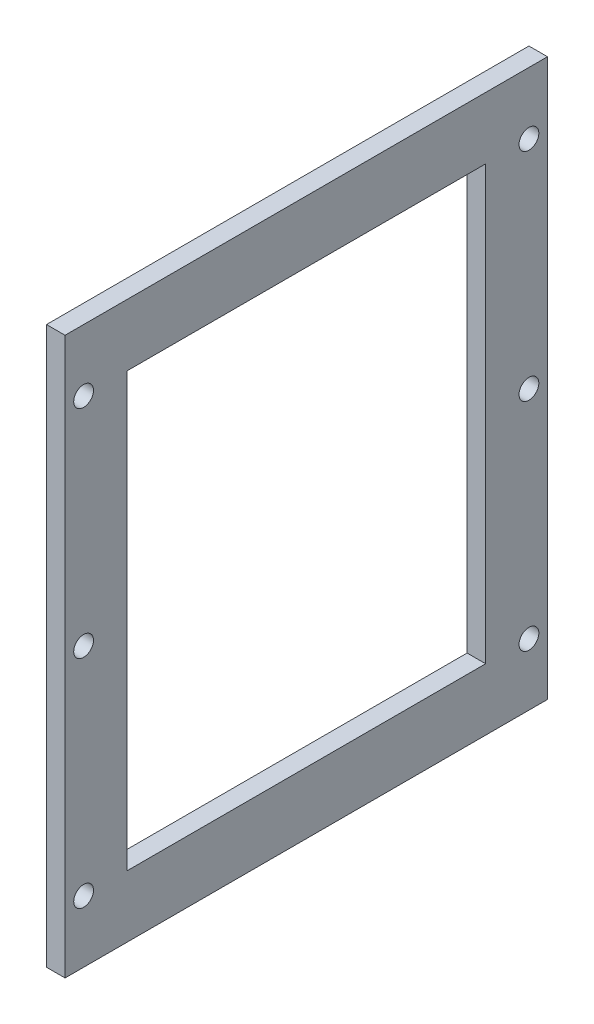
ISO-10303-21;
HEADER;
FILE_DESCRIPTION(('STEP AP214'),'2;1');
FILE_NAME('part.step','',(''),(''),'','','');
FILE_SCHEMA(('AUTOMOTIVE_DESIGN { 1 0 10303 214 1 1 1 1 }'));
ENDSEC;
DATA;
#1=APPLICATION_CONTEXT('core data for automotive mechanical design processes');
#2=APPLICATION_PROTOCOL_DEFINITION('international standard','automotive_design',2000,#1);
#3=PRODUCT_CONTEXT('',#1,'mechanical');
#4=PRODUCT('Part','Part','',(#3));
#5=PRODUCT_RELATED_PRODUCT_CATEGORY('part','',(#4));
#6=PRODUCT_DEFINITION_FORMATION('','',#4);
#7=PRODUCT_DEFINITION_CONTEXT('part definition',#1,'design');
#8=PRODUCT_DEFINITION('design','',#6,#7);
#9=PRODUCT_DEFINITION_SHAPE('','',#8);
#10=(LENGTH_UNIT() NAMED_UNIT(*) SI_UNIT(.MILLI.,.METRE.));
#11=(NAMED_UNIT(*) PLANE_ANGLE_UNIT() SI_UNIT($,.RADIAN.));
#12=(NAMED_UNIT(*) SI_UNIT($,.STERADIAN.) SOLID_ANGLE_UNIT());
#13=UNCERTAINTY_MEASURE_WITH_UNIT(LENGTH_MEASURE(1.E-05),#10,'distance_accuracy_value','');
#14=(GEOMETRIC_REPRESENTATION_CONTEXT(3) GLOBAL_UNCERTAINTY_ASSIGNED_CONTEXT((#13)) GLOBAL_UNIT_ASSIGNED_CONTEXT((#10,
#11,#12)) REPRESENTATION_CONTEXT('',''));
#15=CARTESIAN_POINT('',(0.,0.,0.));
#16=DIRECTION('',(0.,0.,1.));
#17=DIRECTION('',(1.,0.,0.));
#18=AXIS2_PLACEMENT_3D('',#15,#16,#17);
#19=CARTESIAN_POINT('',(15.,0.,0.));
#20=DIRECTION('',(1.,0.,0.));
#21=DIRECTION('',(0.,0.,-1.));
#22=AXIS2_PLACEMENT_3D('',#19,#20,#21);
#23=PLANE('',#22);
#24=CARTESIAN_POINT('',(15.,0.,-180.));
#25=DIRECTION('',(1.,0.,0.));
#26=DIRECTION('',(0.,0.,1.));
#27=AXIS2_PLACEMENT_3D('',#24,#25,#26);
#28=CIRCLE('',#27,8.00000000000001);
#29=CARTESIAN_POINT('',(15.,0.,-172.));
#30=VERTEX_POINT('',#29);
#31=EDGE_CURVE('E255',#30,#30,#28,.T.);
#32=ORIENTED_EDGE('',*,*,#31,.F.);
#33=EDGE_LOOP('',(#32));
#34=FACE_BOUND('',#33,.T.);
#35=CARTESIAN_POINT('',(15.,0.,180.));
#36=DIRECTION('',(1.,0.,0.));
#37=DIRECTION('',(0.,0.,-1.));
#38=AXIS2_PLACEMENT_3D('',#35,#36,#37);
#39=CIRCLE('',#38,8.00000000000001);
#40=CARTESIAN_POINT('',(15.,0.,172.));
#41=VERTEX_POINT('',#40);
#42=EDGE_CURVE('E267',#41,#41,#39,.T.);
#43=ORIENTED_EDGE('',*,*,#42,.F.);
#44=EDGE_LOOP('',(#43));
#45=FACE_BOUND('',#44,.T.);
#46=CARTESIAN_POINT('',(15.,175.,180.));
#47=DIRECTION('',(1.,0.,0.));
#48=DIRECTION('',(0.,0.,-1.));
#49=AXIS2_PLACEMENT_3D('',#46,#47,#48);
#50=CIRCLE('',#49,8.00000000000001);
#51=CARTESIAN_POINT('',(15.,175.,172.));
#52=VERTEX_POINT('',#51);
#53=EDGE_CURVE('E129',#52,#52,#50,.T.);
#54=ORIENTED_EDGE('',*,*,#53,.F.);
#55=EDGE_LOOP('',(#54));
#56=FACE_BOUND('',#55,.T.);
#57=DIRECTION('',(0.,1.,0.));
#58=VECTOR('',#57,1.);
#59=CARTESIAN_POINT('',(15.,225.,-195.));
#60=LINE('',#59,#58);
#61=CARTESIAN_POINT('',(15.,-225.,-195.));
#62=VERTEX_POINT('',#61);
#63=CARTESIAN_POINT('',(15.,225.,-195.));
#64=VERTEX_POINT('',#63);
#65=EDGE_CURVE('E139',#62,#64,#60,.T.);
#66=ORIENTED_EDGE('',*,*,#65,.T.);
#67=DIRECTION('',(0.,0.,1.));
#68=VECTOR('',#67,1.);
#69=CARTESIAN_POINT('',(15.,225.,195.));
#70=LINE('',#69,#68);
#71=CARTESIAN_POINT('',(15.,225.,195.));
#72=VERTEX_POINT('',#71);
#73=EDGE_CURVE('E142',#64,#72,#70,.T.);
#74=ORIENTED_EDGE('',*,*,#73,.T.);
#75=DIRECTION('',(0.,-1.,0.));
#76=VECTOR('',#75,1.);
#77=CARTESIAN_POINT('',(15.,225.,195.));
#78=LINE('',#77,#76);
#79=CARTESIAN_POINT('',(15.,-225.,195.));
#80=VERTEX_POINT('',#79);
#81=EDGE_CURVE('E145',#72,#80,#78,.T.);
#82=ORIENTED_EDGE('',*,*,#81,.T.);
#83=DIRECTION('',(0.,0.,-1.));
#84=VECTOR('',#83,1.);
#85=CARTESIAN_POINT('',(15.,-225.,195.));
#86=LINE('',#85,#84);
#87=EDGE_CURVE('E147',#80,#62,#86,.T.);
#88=ORIENTED_EDGE('',*,*,#87,.T.);
#89=EDGE_LOOP('',(#66,#74,#82,#88));
#90=FACE_BOUND('',#89,.T.);
#91=DIRECTION('',(0.,0.,1.));
#92=VECTOR('',#91,1.);
#93=CARTESIAN_POINT('',(15.,175.,145.));
#94=LINE('',#93,#92);
#95=CARTESIAN_POINT('',(15.,175.,-145.));
#96=VERTEX_POINT('',#95);
#97=CARTESIAN_POINT('',(15.,175.,145.));
#98=VERTEX_POINT('',#97);
#99=EDGE_CURVE('E108',#96,#98,#94,.T.);
#100=ORIENTED_EDGE('',*,*,#99,.F.);
#101=DIRECTION('',(0.,1.,0.));
#102=VECTOR('',#101,1.);
#103=CARTESIAN_POINT('',(15.,175.,-145.));
#104=LINE('',#103,#102);
#105=CARTESIAN_POINT('',(15.,-175.,-145.));
#106=VERTEX_POINT('',#105);
#107=EDGE_CURVE('E100',#106,#96,#104,.T.);
#108=ORIENTED_EDGE('',*,*,#107,.F.);
#109=DIRECTION('',(0.,0.,-1.));
#110=VECTOR('',#109,1.);
#111=CARTESIAN_POINT('',(15.,-175.,145.));
#112=LINE('',#111,#110);
#113=CARTESIAN_POINT('',(15.,-175.,145.));
#114=VERTEX_POINT('',#113);
#115=EDGE_CURVE('E123',#114,#106,#112,.T.);
#116=ORIENTED_EDGE('',*,*,#115,.F.);
#117=DIRECTION('',(0.,-1.,0.));
#118=VECTOR('',#117,1.);
#119=CARTESIAN_POINT('',(15.,175.,145.));
#120=LINE('',#119,#118);
#121=EDGE_CURVE('E121',#98,#114,#120,.T.);
#122=ORIENTED_EDGE('',*,*,#121,.F.);
#123=EDGE_LOOP('',(#100,#108,#116,#122));
#124=FACE_BOUND('',#123,.T.);
#125=CARTESIAN_POINT('',(15.,-175.,180.));
#126=DIRECTION('',(1.,0.,0.));
#127=DIRECTION('',(0.,0.,1.));
#128=AXIS2_PLACEMENT_3D('',#125,#126,#127);
#129=CIRCLE('',#128,8.00000000000001);
#130=CARTESIAN_POINT('',(15.,-175.,188.));
#131=VERTEX_POINT('',#130);
#132=EDGE_CURVE('E273',#131,#131,#129,.T.);
#133=ORIENTED_EDGE('',*,*,#132,.F.);
#134=EDGE_LOOP('',(#133));
#135=FACE_BOUND('',#134,.T.);
#136=CARTESIAN_POINT('',(15.,175.,-180.));
#137=DIRECTION('',(1.,0.,0.));
#138=DIRECTION('',(0.,0.,1.));
#139=AXIS2_PLACEMENT_3D('',#136,#137,#138);
#140=CIRCLE('',#139,8.00000000000001);
#141=CARTESIAN_POINT('',(15.,175.,-172.));
#142=VERTEX_POINT('',#141);
#143=EDGE_CURVE('E261',#142,#142,#140,.T.);
#144=ORIENTED_EDGE('',*,*,#143,.F.);
#145=EDGE_LOOP('',(#144));
#146=FACE_BOUND('',#145,.T.);
#147=CARTESIAN_POINT('',(15.,-175.,-180.));
#148=DIRECTION('',(1.,0.,0.));
#149=DIRECTION('',(0.,0.,-1.));
#150=AXIS2_PLACEMENT_3D('',#147,#148,#149);
#151=CIRCLE('',#150,8.00000000000001);
#152=CARTESIAN_POINT('',(15.,-175.,-188.));
#153=VERTEX_POINT('',#152);
#154=EDGE_CURVE('E246',#153,#153,#151,.T.);
#155=ORIENTED_EDGE('',*,*,#154,.F.);
#156=EDGE_LOOP('',(#155));
#157=FACE_BOUND('',#156,.T.);
#158=ADVANCED_FACE('F35',(#34,#45,#56,#90,#124,#135,#146,#157),#23,.T.);
#159=CARTESIAN_POINT('',(0.,0.,0.));
#160=DIRECTION('',(1.,0.,0.));
#161=DIRECTION('',(0.,0.,-1.));
#162=AXIS2_PLACEMENT_3D('',#159,#160,#161);
#163=PLANE('',#162);
#164=DIRECTION('',(0.,1.,0.));
#165=VECTOR('',#164,1.);
#166=CARTESIAN_POINT('',(0.,225.,-195.));
#167=LINE('',#166,#165);
#168=CARTESIAN_POINT('',(0.,-225.,-195.));
#169=VERTEX_POINT('',#168);
#170=CARTESIAN_POINT('',(0.,225.,-195.));
#171=VERTEX_POINT('',#170);
#172=EDGE_CURVE('E116',#169,#171,#167,.T.);
#173=ORIENTED_EDGE('',*,*,#172,.F.);
#174=DIRECTION('',(0.,0.,-1.));
#175=VECTOR('',#174,1.);
#176=CARTESIAN_POINT('',(0.,-225.,195.));
#177=LINE('',#176,#175);
#178=CARTESIAN_POINT('',(0.,-225.,195.));
#179=VERTEX_POINT('',#178);
#180=EDGE_CURVE('E143',#179,#169,#177,.T.);
#181=ORIENTED_EDGE('',*,*,#180,.F.);
#182=DIRECTION('',(0.,-1.,0.));
#183=VECTOR('',#182,1.);
#184=CARTESIAN_POINT('',(0.,225.,195.));
#185=LINE('',#184,#183);
#186=CARTESIAN_POINT('',(0.,225.,195.));
#187=VERTEX_POINT('',#186);
#188=EDGE_CURVE('E154',#187,#179,#185,.T.);
#189=ORIENTED_EDGE('',*,*,#188,.F.);
#190=DIRECTION('',(0.,0.,1.));
#191=VECTOR('',#190,1.);
#192=CARTESIAN_POINT('',(0.,225.,195.));
#193=LINE('',#192,#191);
#194=EDGE_CURVE('E152',#171,#187,#193,.T.);
#195=ORIENTED_EDGE('',*,*,#194,.F.);
#196=EDGE_LOOP('',(#173,#181,#189,#195));
#197=FACE_BOUND('',#196,.T.);
#198=DIRECTION('',(0.,1.,0.));
#199=VECTOR('',#198,1.);
#200=CARTESIAN_POINT('',(0.,175.,-145.));
#201=LINE('',#200,#199);
#202=CARTESIAN_POINT('',(0.,-175.,-145.));
#203=VERTEX_POINT('',#202);
#204=CARTESIAN_POINT('',(0.,175.,-145.));
#205=VERTEX_POINT('',#204);
#206=EDGE_CURVE('E58',#203,#205,#201,.T.);
#207=ORIENTED_EDGE('',*,*,#206,.T.);
#208=DIRECTION('',(0.,0.,1.));
#209=VECTOR('',#208,1.);
#210=CARTESIAN_POINT('',(0.,175.,145.));
#211=LINE('',#210,#209);
#212=CARTESIAN_POINT('',(0.,175.,145.));
#213=VERTEX_POINT('',#212);
#214=EDGE_CURVE('E115',#205,#213,#211,.T.);
#215=ORIENTED_EDGE('',*,*,#214,.T.);
#216=DIRECTION('',(0.,-1.,0.));
#217=VECTOR('',#216,1.);
#218=CARTESIAN_POINT('',(0.,175.,145.));
#219=LINE('',#218,#217);
#220=CARTESIAN_POINT('',(0.,-175.,145.));
#221=VERTEX_POINT('',#220);
#222=EDGE_CURVE('E131',#213,#221,#219,.T.);
#223=ORIENTED_EDGE('',*,*,#222,.T.);
#224=DIRECTION('',(0.,0.,-1.));
#225=VECTOR('',#224,1.);
#226=CARTESIAN_POINT('',(0.,-175.,145.));
#227=LINE('',#226,#225);
#228=EDGE_CURVE('E109',#221,#203,#227,.T.);
#229=ORIENTED_EDGE('',*,*,#228,.T.);
#230=EDGE_LOOP('',(#207,#215,#223,#229));
#231=FACE_BOUND('',#230,.T.);
#232=CARTESIAN_POINT('',(0.,175.,180.));
#233=DIRECTION('',(1.,0.,0.));
#234=DIRECTION('',(0.,0.,-1.));
#235=AXIS2_PLACEMENT_3D('',#232,#233,#234);
#236=CIRCLE('',#235,8.00000000000001);
#237=CARTESIAN_POINT('',(0.,175.,172.));
#238=VERTEX_POINT('',#237);
#239=EDGE_CURVE('E276',#238,#238,#236,.T.);
#240=ORIENTED_EDGE('',*,*,#239,.T.);
#241=EDGE_LOOP('',(#240));
#242=FACE_BOUND('',#241,.T.);
#243=CARTESIAN_POINT('',(0.,-175.,180.));
#244=DIRECTION('',(1.,0.,0.));
#245=DIRECTION('',(0.,0.,1.));
#246=AXIS2_PLACEMENT_3D('',#243,#244,#245);
#247=CIRCLE('',#246,8.00000000000001);
#248=CARTESIAN_POINT('',(0.,-175.,188.));
#249=VERTEX_POINT('',#248);
#250=EDGE_CURVE('E270',#249,#249,#247,.T.);
#251=ORIENTED_EDGE('',*,*,#250,.T.);
#252=EDGE_LOOP('',(#251));
#253=FACE_BOUND('',#252,.T.);
#254=CARTESIAN_POINT('',(0.,0.,180.));
#255=DIRECTION('',(1.,0.,0.));
#256=DIRECTION('',(0.,0.,-1.));
#257=AXIS2_PLACEMENT_3D('',#254,#255,#256);
#258=CIRCLE('',#257,8.00000000000001);
#259=CARTESIAN_POINT('',(0.,0.,172.));
#260=VERTEX_POINT('',#259);
#261=EDGE_CURVE('E264',#260,#260,#258,.T.);
#262=ORIENTED_EDGE('',*,*,#261,.T.);
#263=EDGE_LOOP('',(#262));
#264=FACE_BOUND('',#263,.T.);
#265=CARTESIAN_POINT('',(0.,175.,-180.));
#266=DIRECTION('',(1.,0.,0.));
#267=DIRECTION('',(0.,0.,1.));
#268=AXIS2_PLACEMENT_3D('',#265,#266,#267);
#269=CIRCLE('',#268,8.00000000000001);
#270=CARTESIAN_POINT('',(0.,175.,-172.));
#271=VERTEX_POINT('',#270);
#272=EDGE_CURVE('E258',#271,#271,#269,.T.);
#273=ORIENTED_EDGE('',*,*,#272,.T.);
#274=EDGE_LOOP('',(#273));
#275=FACE_BOUND('',#274,.T.);
#276=CARTESIAN_POINT('',(0.,0.,-180.));
#277=DIRECTION('',(1.,0.,0.));
#278=DIRECTION('',(0.,0.,1.));
#279=AXIS2_PLACEMENT_3D('',#276,#277,#278);
#280=CIRCLE('',#279,8.00000000000001);
#281=CARTESIAN_POINT('',(0.,0.,-172.));
#282=VERTEX_POINT('',#281);
#283=EDGE_CURVE('E252',#282,#282,#280,.T.);
#284=ORIENTED_EDGE('',*,*,#283,.T.);
#285=EDGE_LOOP('',(#284));
#286=FACE_BOUND('',#285,.T.);
#287=CARTESIAN_POINT('',(0.,-175.,-180.));
#288=DIRECTION('',(1.,0.,0.));
#289=DIRECTION('',(0.,0.,-1.));
#290=AXIS2_PLACEMENT_3D('',#287,#288,#289);
#291=CIRCLE('',#290,8.00000000000001);
#292=CARTESIAN_POINT('',(0.,-175.,-188.));
#293=VERTEX_POINT('',#292);
#294=EDGE_CURVE('E249',#293,#293,#291,.T.);
#295=ORIENTED_EDGE('',*,*,#294,.T.);
#296=EDGE_LOOP('',(#295));
#297=FACE_BOUND('',#296,.T.);
#298=ADVANCED_FACE('F172',(#197,#231,#242,#253,#264,#275,#286,#297),#163,.F.);
#299=CARTESIAN_POINT('',(15.,225.,-195.));
#300=DIRECTION('',(0.,0.,1.));
#301=DIRECTION('',(0.,-1.,0.));
#302=AXIS2_PLACEMENT_3D('',#299,#300,#301);
#303=PLANE('',#302);
#304=ORIENTED_EDGE('',*,*,#172,.T.);
#305=DIRECTION('',(-1.,0.,0.));
#306=VECTOR('',#305,1.);
#307=CARTESIAN_POINT('',(15.,225.,-195.));
#308=LINE('',#307,#306);
#309=EDGE_CURVE('E11',#64,#171,#308,.T.);
#310=ORIENTED_EDGE('',*,*,#309,.F.);
#311=ORIENTED_EDGE('',*,*,#65,.F.);
#312=DIRECTION('',(-1.,0.,0.));
#313=VECTOR('',#312,1.);
#314=CARTESIAN_POINT('',(15.,-225.,-195.));
#315=LINE('',#314,#313);
#316=EDGE_CURVE('E149',#62,#169,#315,.T.);
#317=ORIENTED_EDGE('',*,*,#316,.T.);
#318=EDGE_LOOP('',(#304,#310,#311,#317));
#319=FACE_BOUND('',#318,.T.);
#320=ADVANCED_FACE('F37',(#319),#303,.F.);
#321=CARTESIAN_POINT('',(15.,225.,195.));
#322=DIRECTION('',(0.,-1.,0.));
#323=DIRECTION('',(0.,0.,-1.));
#324=AXIS2_PLACEMENT_3D('',#321,#322,#323);
#325=PLANE('',#324);
#326=ORIENTED_EDGE('',*,*,#194,.T.);
#327=DIRECTION('',(-1.,0.,0.));
#328=VECTOR('',#327,1.);
#329=CARTESIAN_POINT('',(15.,225.,195.));
#330=LINE('',#329,#328);
#331=EDGE_CURVE('E43',#72,#187,#330,.T.);
#332=ORIENTED_EDGE('',*,*,#331,.F.);
#333=ORIENTED_EDGE('',*,*,#73,.F.);
#334=ORIENTED_EDGE('',*,*,#309,.T.);
#335=EDGE_LOOP('',(#326,#332,#333,#334));
#336=FACE_BOUND('',#335,.T.);
#337=ADVANCED_FACE('F182',(#336),#325,.F.);
#338=CARTESIAN_POINT('',(15.,225.,195.));
#339=DIRECTION('',(0.,0.,-1.));
#340=DIRECTION('',(0.,1.,0.));
#341=AXIS2_PLACEMENT_3D('',#338,#339,#340);
#342=PLANE('',#341);
#343=ORIENTED_EDGE('',*,*,#188,.T.);
#344=DIRECTION('',(-1.,0.,0.));
#345=VECTOR('',#344,1.);
#346=CARTESIAN_POINT('',(15.,-225.,195.));
#347=LINE('',#346,#345);
#348=EDGE_CURVE('E159',#80,#179,#347,.T.);
#349=ORIENTED_EDGE('',*,*,#348,.F.);
#350=ORIENTED_EDGE('',*,*,#81,.F.);
#351=ORIENTED_EDGE('',*,*,#331,.T.);
#352=EDGE_LOOP('',(#343,#349,#350,#351));
#353=FACE_BOUND('',#352,.T.);
#354=ADVANCED_FACE('F166',(#353),#342,.F.);
#355=CARTESIAN_POINT('',(15.,-225.,195.));
#356=DIRECTION('',(0.,1.,0.));
#357=DIRECTION('',(0.,0.,1.));
#358=AXIS2_PLACEMENT_3D('',#355,#356,#357);
#359=PLANE('',#358);
#360=ORIENTED_EDGE('',*,*,#180,.T.);
#361=ORIENTED_EDGE('',*,*,#316,.F.);
#362=ORIENTED_EDGE('',*,*,#87,.F.);
#363=ORIENTED_EDGE('',*,*,#348,.T.);
#364=EDGE_LOOP('',(#360,#361,#362,#363));
#365=FACE_BOUND('',#364,.T.);
#366=ADVANCED_FACE('F176',(#365),#359,.F.);
#367=CARTESIAN_POINT('',(15.,175.,-145.));
#368=DIRECTION('',(0.,0.,1.));
#369=DIRECTION('',(0.,-1.,0.));
#370=AXIS2_PLACEMENT_3D('',#367,#368,#369);
#371=PLANE('',#370);
#372=ORIENTED_EDGE('',*,*,#206,.F.);
#373=DIRECTION('',(-1.,0.,0.));
#374=VECTOR('',#373,1.);
#375=CARTESIAN_POINT('',(15.,-175.,-145.));
#376=LINE('',#375,#374);
#377=EDGE_CURVE('E104',#106,#203,#376,.T.);
#378=ORIENTED_EDGE('',*,*,#377,.F.);
#379=ORIENTED_EDGE('',*,*,#107,.T.);
#380=DIRECTION('',(-1.,0.,0.));
#381=VECTOR('',#380,1.);
#382=CARTESIAN_POINT('',(15.,175.,-145.));
#383=LINE('',#382,#381);
#384=EDGE_CURVE('E103',#96,#205,#383,.T.);
#385=ORIENTED_EDGE('',*,*,#384,.T.);
#386=EDGE_LOOP('',(#372,#378,#379,#385));
#387=FACE_BOUND('',#386,.T.);
#388=ADVANCED_FACE('F102',(#387),#371,.T.);
#389=CARTESIAN_POINT('',(15.,175.,145.));
#390=DIRECTION('',(0.,-1.,0.));
#391=DIRECTION('',(0.,0.,-1.));
#392=AXIS2_PLACEMENT_3D('',#389,#390,#391);
#393=PLANE('',#392);
#394=ORIENTED_EDGE('',*,*,#214,.F.);
#395=ORIENTED_EDGE('',*,*,#384,.F.);
#396=ORIENTED_EDGE('',*,*,#99,.T.);
#397=DIRECTION('',(-1.,0.,0.));
#398=VECTOR('',#397,1.);
#399=CARTESIAN_POINT('',(15.,175.,145.));
#400=LINE('',#399,#398);
#401=EDGE_CURVE('E117',#98,#213,#400,.T.);
#402=ORIENTED_EDGE('',*,*,#401,.T.);
#403=EDGE_LOOP('',(#394,#395,#396,#402));
#404=FACE_BOUND('',#403,.T.);
#405=ADVANCED_FACE('F112',(#404),#393,.T.);
#406=CARTESIAN_POINT('',(15.,175.,145.));
#407=DIRECTION('',(0.,0.,-1.));
#408=DIRECTION('',(0.,1.,0.));
#409=AXIS2_PLACEMENT_3D('',#406,#407,#408);
#410=PLANE('',#409);
#411=ORIENTED_EDGE('',*,*,#222,.F.);
#412=ORIENTED_EDGE('',*,*,#401,.F.);
#413=ORIENTED_EDGE('',*,*,#121,.T.);
#414=DIRECTION('',(-1.,0.,0.));
#415=VECTOR('',#414,1.);
#416=CARTESIAN_POINT('',(15.,-175.,145.));
#417=LINE('',#416,#415);
#418=EDGE_CURVE('E50',#114,#221,#417,.T.);
#419=ORIENTED_EDGE('',*,*,#418,.T.);
#420=EDGE_LOOP('',(#411,#412,#413,#419));
#421=FACE_BOUND('',#420,.T.);
#422=ADVANCED_FACE('F208',(#421),#410,.T.);
#423=CARTESIAN_POINT('',(15.,-175.,145.));
#424=DIRECTION('',(0.,1.,0.));
#425=DIRECTION('',(0.,0.,1.));
#426=AXIS2_PLACEMENT_3D('',#423,#424,#425);
#427=PLANE('',#426);
#428=ORIENTED_EDGE('',*,*,#228,.F.);
#429=ORIENTED_EDGE('',*,*,#418,.F.);
#430=ORIENTED_EDGE('',*,*,#115,.T.);
#431=ORIENTED_EDGE('',*,*,#377,.T.);
#432=EDGE_LOOP('',(#428,#429,#430,#431));
#433=FACE_BOUND('',#432,.T.);
#434=ADVANCED_FACE('F212',(#433),#427,.T.);
#435=CARTESIAN_POINT('',(15.,175.,180.));
#436=DIRECTION('',(-1.,0.,0.));
#437=DIRECTION('',(0.,0.,1.));
#438=AXIS2_PLACEMENT_3D('',#435,#436,#437);
#439=CYLINDRICAL_SURFACE('',#438,8.00000000000001);
#440=ORIENTED_EDGE('',*,*,#53,.T.);
#441=EDGE_LOOP('',(#440));
#442=FACE_BOUND('',#441,.T.);
#443=ORIENTED_EDGE('',*,*,#239,.F.);
#444=EDGE_LOOP('',(#443));
#445=FACE_BOUND('',#444,.T.);
#446=ADVANCED_FACE('F218',(#442,#445),#439,.F.);
#447=CARTESIAN_POINT('',(15.,-175.,180.));
#448=DIRECTION('',(-1.,0.,0.));
#449=DIRECTION('',(0.,0.,1.));
#450=AXIS2_PLACEMENT_3D('',#447,#448,#449);
#451=CYLINDRICAL_SURFACE('',#450,8.00000000000001);
#452=ORIENTED_EDGE('',*,*,#132,.T.);
#453=EDGE_LOOP('',(#452));
#454=FACE_BOUND('',#453,.T.);
#455=ORIENTED_EDGE('',*,*,#250,.F.);
#456=EDGE_LOOP('',(#455));
#457=FACE_BOUND('',#456,.T.);
#458=ADVANCED_FACE('F221',(#454,#457),#451,.F.);
#459=CARTESIAN_POINT('',(15.,0.,180.));
#460=DIRECTION('',(-1.,0.,0.));
#461=DIRECTION('',(0.,0.,1.));
#462=AXIS2_PLACEMENT_3D('',#459,#460,#461);
#463=CYLINDRICAL_SURFACE('',#462,8.00000000000001);
#464=ORIENTED_EDGE('',*,*,#42,.T.);
#465=EDGE_LOOP('',(#464));
#466=FACE_BOUND('',#465,.T.);
#467=ORIENTED_EDGE('',*,*,#261,.F.);
#468=EDGE_LOOP('',(#467));
#469=FACE_BOUND('',#468,.T.);
#470=ADVANCED_FACE('F225',(#466,#469),#463,.F.);
#471=CARTESIAN_POINT('',(15.,175.,-180.));
#472=DIRECTION('',(-1.,0.,0.));
#473=DIRECTION('',(0.,0.,1.));
#474=AXIS2_PLACEMENT_3D('',#471,#472,#473);
#475=CYLINDRICAL_SURFACE('',#474,8.00000000000001);
#476=ORIENTED_EDGE('',*,*,#143,.T.);
#477=EDGE_LOOP('',(#476));
#478=FACE_BOUND('',#477,.T.);
#479=ORIENTED_EDGE('',*,*,#272,.F.);
#480=EDGE_LOOP('',(#479));
#481=FACE_BOUND('',#480,.T.);
#482=ADVANCED_FACE('F229',(#478,#481),#475,.F.);
#483=CARTESIAN_POINT('',(15.,0.,-180.));
#484=DIRECTION('',(-1.,0.,0.));
#485=DIRECTION('',(0.,0.,1.));
#486=AXIS2_PLACEMENT_3D('',#483,#484,#485);
#487=CYLINDRICAL_SURFACE('',#486,8.00000000000001);
#488=ORIENTED_EDGE('',*,*,#31,.T.);
#489=EDGE_LOOP('',(#488));
#490=FACE_BOUND('',#489,.T.);
#491=ORIENTED_EDGE('',*,*,#283,.F.);
#492=EDGE_LOOP('',(#491));
#493=FACE_BOUND('',#492,.T.);
#494=ADVANCED_FACE('F233',(#490,#493),#487,.F.);
#495=CARTESIAN_POINT('',(15.,-175.,-180.));
#496=DIRECTION('',(-1.,0.,0.));
#497=DIRECTION('',(0.,0.,1.));
#498=AXIS2_PLACEMENT_3D('',#495,#496,#497);
#499=CYLINDRICAL_SURFACE('',#498,8.00000000000001);
#500=ORIENTED_EDGE('',*,*,#154,.T.);
#501=EDGE_LOOP('',(#500));
#502=FACE_BOUND('',#501,.T.);
#503=ORIENTED_EDGE('',*,*,#294,.F.);
#504=EDGE_LOOP('',(#503));
#505=FACE_BOUND('',#504,.T.);
#506=ADVANCED_FACE('F237',(#502,#505),#499,.F.);
#507=CLOSED_SHELL('',(#158,#298,#320,#337,#354,#366,#388,#405,#422,#434,#446,#458,#470,#482,
#494,#506));
#508=MANIFOLD_SOLID_BREP('B2',#507);
#509=ADVANCED_BREP_SHAPE_REPRESENTATION('',(#18,#508),#14);
#510=SHAPE_DEFINITION_REPRESENTATION(#9,#509);
ENDSEC;
END-ISO-10303-21;
